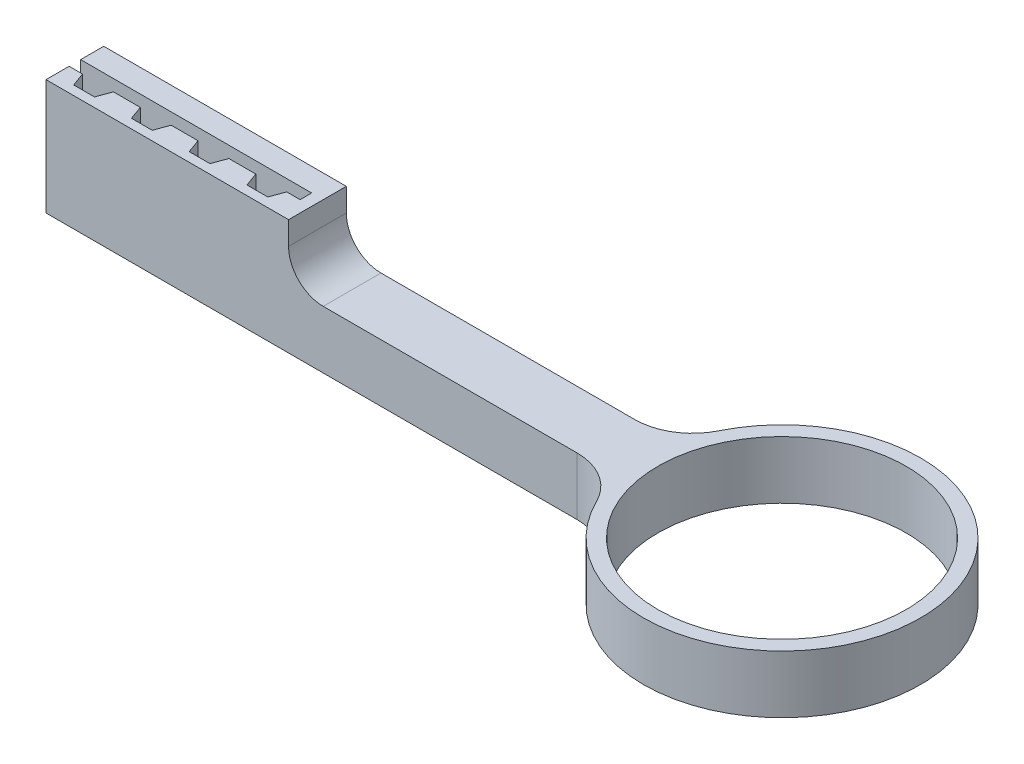
ISO-10303-21;
HEADER;
FILE_DESCRIPTION(('STEP AP214'),'2;1');
FILE_NAME('part.step','',(''),(''),'','','');
FILE_SCHEMA(('AUTOMOTIVE_DESIGN { 1 0 10303 214 1 1 1 1 }'));
ENDSEC;
DATA;
#1=APPLICATION_CONTEXT('core data for automotive mechanical design processes');
#2=APPLICATION_PROTOCOL_DEFINITION('international standard','automotive_design',2000,#1);
#3=PRODUCT_CONTEXT('',#1,'mechanical');
#4=PRODUCT('Part','Part','',(#3));
#5=PRODUCT_RELATED_PRODUCT_CATEGORY('part','',(#4));
#6=PRODUCT_DEFINITION_FORMATION('','',#4);
#7=PRODUCT_DEFINITION_CONTEXT('part definition',#1,'design');
#8=PRODUCT_DEFINITION('design','',#6,#7);
#9=PRODUCT_DEFINITION_SHAPE('','',#8);
#10=(LENGTH_UNIT() NAMED_UNIT(*) SI_UNIT(.MILLI.,.METRE.));
#11=(NAMED_UNIT(*) PLANE_ANGLE_UNIT() SI_UNIT($,.RADIAN.));
#12=(NAMED_UNIT(*) SI_UNIT($,.STERADIAN.) SOLID_ANGLE_UNIT());
#13=UNCERTAINTY_MEASURE_WITH_UNIT(LENGTH_MEASURE(1.E-05),#10,'distance_accuracy_value','');
#14=(GEOMETRIC_REPRESENTATION_CONTEXT(3) GLOBAL_UNCERTAINTY_ASSIGNED_CONTEXT((#13)) GLOBAL_UNIT_ASSIGNED_CONTEXT((#10,
#11,#12)) REPRESENTATION_CONTEXT('',''));
#15=CARTESIAN_POINT('',(0.,0.,0.));
#16=DIRECTION('',(0.,0.,1.));
#17=DIRECTION('',(1.,0.,0.));
#18=AXIS2_PLACEMENT_3D('',#15,#16,#17);
#19=CARTESIAN_POINT('',(-61.2249721603218,5.,-2.49999999999999));
#20=DIRECTION('',(1.,0.,0.));
#21=DIRECTION('',(0.,0.,-1.));
#22=AXIS2_PLACEMENT_3D('',#19,#20,#21);
#23=PLANE('',#22);
#24=DIRECTION('',(0.,0.,1.));
#25=VECTOR('',#24,1.);
#26=CARTESIAN_POINT('',(-61.2249721603218,0.,-2.49999999999999));
#27=LINE('',#26,#25);
#28=CARTESIAN_POINT('',(-61.2249721603218,0.,-2.49999999999999));
#29=VERTEX_POINT('',#28);
#30=CARTESIAN_POINT('',(-61.2249721603218,0.,-0.5));
#31=VERTEX_POINT('',#30);
#32=EDGE_CURVE('E409',#29,#31,#27,.T.);
#33=ORIENTED_EDGE('',*,*,#32,.T.);
#34=DIRECTION('',(0.,1.,0.));
#35=VECTOR('',#34,1.);
#36=CARTESIAN_POINT('',(-61.2249721603218,0.,-0.5));
#37=LINE('',#36,#35);
#38=CARTESIAN_POINT('',(-61.2249721603218,10.,-0.5));
#39=VERTEX_POINT('',#38);
#40=EDGE_CURVE('E346',#31,#39,#37,.T.);
#41=ORIENTED_EDGE('',*,*,#40,.T.);
#42=DIRECTION('',(0.,0.,1.));
#43=VECTOR('',#42,1.);
#44=CARTESIAN_POINT('',(-61.2249721603218,10.,-2.49999999999999));
#45=LINE('',#44,#43);
#46=CARTESIAN_POINT('',(-61.2249721603218,10.,-2.49999999999999));
#47=VERTEX_POINT('',#46);
#48=EDGE_CURVE('E384',#47,#39,#45,.T.);
#49=ORIENTED_EDGE('',*,*,#48,.F.);
#50=DIRECTION('',(0.,-1.,0.));
#51=VECTOR('',#50,1.);
#52=CARTESIAN_POINT('',(-61.2249721603218,5.,-2.49999999999999));
#53=LINE('',#52,#51);
#54=EDGE_CURVE('E416',#47,#29,#53,.T.);
#55=ORIENTED_EDGE('',*,*,#54,.T.);
#56=EDGE_LOOP('',(#33,#41,#49,#55));
#57=FACE_BOUND('',#56,.T.);
#58=ADVANCED_FACE('F31',(#57),#23,.F.);
#59=CARTESIAN_POINT('',(0.,5.,0.));
#60=DIRECTION('',(0.,1.,0.));
#61=DIRECTION('',(0.,0.,1.));
#62=AXIS2_PLACEMENT_3D('',#59,#60,#61);
#63=PLANE('',#62);
#64=CARTESIAN_POINT('',(0.,5.,0.));
#65=DIRECTION('',(0.,1.,0.));
#66=DIRECTION('',(0.,0.,1.));
#67=AXIS2_PLACEMENT_3D('',#64,#65,#66);
#68=CIRCLE('',#67,10.75);
#69=CARTESIAN_POINT('',(0.,5.,10.75));
#70=VERTEX_POINT('',#69);
#71=EDGE_CURVE('E420',#70,#70,#68,.T.);
#72=ORIENTED_EDGE('',*,*,#71,.F.);
#73=EDGE_LOOP('',(#72));
#74=FACE_BOUND('',#73,.T.);
#75=DIRECTION('',(-1.,0.,0.));
#76=VECTOR('',#75,1.);
#77=CARTESIAN_POINT('',(-11.2249721603218,5.,-2.49999999999999));
#78=LINE('',#77,#76);
#79=CARTESIAN_POINT('',(-15.2561463023924,5.,-2.49999999999999));
#80=VERTEX_POINT('',#79);
#81=CARTESIAN_POINT('',(-37.2249721603218,5.,-2.49999999999999));
#82=VERTEX_POINT('',#81);
#83=EDGE_CURVE('E400',#80,#82,#78,.T.);
#84=ORIENTED_EDGE('',*,*,#83,.T.);
#85=DIRECTION('',(0.,0.,1.));
#86=VECTOR('',#85,1.);
#87=CARTESIAN_POINT('',(-37.2249721603218,5.,0.));
#88=LINE('',#87,#86);
#89=CARTESIAN_POINT('',(-37.2249721603218,5.,2.50000000000001));
#90=VERTEX_POINT('',#89);
#91=EDGE_CURVE('E449',#82,#90,#88,.T.);
#92=ORIENTED_EDGE('',*,*,#91,.T.);
#93=DIRECTION('',(1.,0.,0.));
#94=VECTOR('',#93,1.);
#95=CARTESIAN_POINT('',(-11.2249721603218,5.,2.50000000000001));
#96=LINE('',#95,#94);
#97=CARTESIAN_POINT('',(-15.2561463023924,5.,2.50000000000001));
#98=VERTEX_POINT('',#97);
#99=EDGE_CURVE('E403',#90,#98,#96,.T.);
#100=ORIENTED_EDGE('',*,*,#99,.T.);
#101=CARTESIAN_POINT('',(-15.2561463023924,5.,7.50000000000001));
#102=DIRECTION('',(0.,1.,0.));
#103=DIRECTION('',(0.,0.,1.));
#104=AXIS2_PLACEMENT_3D('',#101,#102,#103);
#105=CIRCLE('',#104,5.);
#106=CARTESIAN_POINT('',(-10.7690444487475,5.,5.29411764705883));
#107=VERTEX_POINT('',#106);
#108=EDGE_CURVE('E441',#98,#107,#105,.F.);
#109=ORIENTED_EDGE('',*,*,#108,.T.);
#110=CARTESIAN_POINT('',(0.,5.,0.));
#111=DIRECTION('',(0.,1.,0.));
#112=DIRECTION('',(0.,0.,1.));
#113=AXIS2_PLACEMENT_3D('',#110,#111,#112);
#114=CIRCLE('',#113,12.);
#115=CARTESIAN_POINT('',(-10.7690444487476,5.,-5.29411764705882));
#116=VERTEX_POINT('',#115);
#117=EDGE_CURVE('E426',#107,#116,#114,.T.);
#118=ORIENTED_EDGE('',*,*,#117,.T.);
#119=CARTESIAN_POINT('',(-15.2561463023924,5.,-7.49999999999999));
#120=DIRECTION('',(0.,1.,0.));
#121=DIRECTION('',(0.,0.,1.));
#122=AXIS2_PLACEMENT_3D('',#119,#120,#121);
#123=CIRCLE('',#122,5.);
#124=EDGE_CURVE('E447',#116,#80,#123,.F.);
#125=ORIENTED_EDGE('',*,*,#124,.T.);
#126=EDGE_LOOP('',(#84,#92,#100,#109,#118,#125));
#127=FACE_BOUND('',#126,.T.);
#128=ADVANCED_FACE('F466',(#74,#127),#63,.T.);
#129=CARTESIAN_POINT('',(0.,5.,0.));
#130=DIRECTION('',(0.,-1.,0.));
#131=DIRECTION('',(0.,0.,-1.));
#132=AXIS2_PLACEMENT_3D('',#129,#130,#131);
#133=CYLINDRICAL_SURFACE('',#132,12.);
#134=ORIENTED_EDGE('',*,*,#117,.F.);
#135=DIRECTION('',(0.,-1.,0.));
#136=VECTOR('',#135,1.);
#137=CARTESIAN_POINT('',(-10.7690444487475,5.,5.29411764705883));
#138=LINE('',#137,#136);
#139=CARTESIAN_POINT('',(-10.7690444487475,0.,5.29411764705883));
#140=VERTEX_POINT('',#139);
#141=EDGE_CURVE('E436',#107,#140,#138,.T.);
#142=ORIENTED_EDGE('',*,*,#141,.T.);
#143=CARTESIAN_POINT('',(0.,0.,0.));
#144=DIRECTION('',(0.,1.,0.));
#145=DIRECTION('',(0.,0.,1.));
#146=AXIS2_PLACEMENT_3D('',#143,#144,#145);
#147=CIRCLE('',#146,12.);
#148=CARTESIAN_POINT('',(-10.7690444487476,0.,-5.29411764705882));
#149=VERTEX_POINT('',#148);
#150=EDGE_CURVE('E423',#140,#149,#147,.T.);
#151=ORIENTED_EDGE('',*,*,#150,.T.);
#152=DIRECTION('',(0.,-1.,0.));
#153=VECTOR('',#152,1.);
#154=CARTESIAN_POINT('',(-10.7690444487476,5.,-5.29411764705882));
#155=LINE('',#154,#153);
#156=EDGE_CURVE('E434',#149,#116,#155,.F.);
#157=ORIENTED_EDGE('',*,*,#156,.T.);
#158=EDGE_LOOP('',(#134,#142,#151,#157));
#159=FACE_BOUND('',#158,.T.);
#160=ADVANCED_FACE('F478',(#159),#133,.T.);
#161=CARTESIAN_POINT('',(0.,0.,0.));
#162=DIRECTION('',(0.,1.,0.));
#163=DIRECTION('',(0.,0.,1.));
#164=AXIS2_PLACEMENT_3D('',#161,#162,#163);
#165=PLANE('',#164);
#166=DIRECTION('',(0.,0.,-1.));
#167=VECTOR('',#166,1.);
#168=CARTESIAN_POINT('',(-41.2249721603218,0.,-0.5));
#169=LINE('',#168,#167);
#170=CARTESIAN_POINT('',(-41.2249721603218,0.,0.500000000000014));
#171=VERTEX_POINT('',#170);
#172=CARTESIAN_POINT('',(-41.2249721603218,0.,-0.5));
#173=VERTEX_POINT('',#172);
#174=EDGE_CURVE('E340',#171,#173,#169,.T.);
#175=ORIENTED_EDGE('',*,*,#174,.T.);
#176=DIRECTION('',(-1.,0.,0.));
#177=VECTOR('',#176,1.);
#178=CARTESIAN_POINT('',(-61.2249721603218,0.,-0.5));
#179=LINE('',#178,#177);
#180=EDGE_CURVE('E343',#173,#31,#179,.T.);
#181=ORIENTED_EDGE('',*,*,#180,.T.);
#182=ORIENTED_EDGE('',*,*,#32,.F.);
#183=DIRECTION('',(-1.,0.,0.));
#184=VECTOR('',#183,1.);
#185=CARTESIAN_POINT('',(-11.2249721603218,0.,-2.49999999999999));
#186=LINE('',#185,#184);
#187=CARTESIAN_POINT('',(-15.2561463023924,0.,-2.49999999999999));
#188=VERTEX_POINT('',#187);
#189=EDGE_CURVE('E399',#188,#29,#186,.T.);
#190=ORIENTED_EDGE('',*,*,#189,.F.);
#191=CARTESIAN_POINT('',(-15.2561463023924,0.,-7.49999999999999));
#192=DIRECTION('',(0.,1.,0.));
#193=DIRECTION('',(0.,0.,1.));
#194=AXIS2_PLACEMENT_3D('',#191,#192,#193);
#195=CIRCLE('',#194,5.);
#196=EDGE_CURVE('E445',#188,#149,#195,.T.);
#197=ORIENTED_EDGE('',*,*,#196,.T.);
#198=ORIENTED_EDGE('',*,*,#150,.F.);
#199=CARTESIAN_POINT('',(-15.2561463023924,0.,7.50000000000001));
#200=DIRECTION('',(0.,1.,0.));
#201=DIRECTION('',(0.,0.,1.));
#202=AXIS2_PLACEMENT_3D('',#199,#200,#201);
#203=CIRCLE('',#202,5.);
#204=CARTESIAN_POINT('',(-15.2561463023924,0.,2.50000000000001));
#205=VERTEX_POINT('',#204);
#206=EDGE_CURVE('E443',#140,#205,#203,.T.);
#207=ORIENTED_EDGE('',*,*,#206,.T.);
#208=DIRECTION('',(1.,0.,0.));
#209=VECTOR('',#208,1.);
#210=CARTESIAN_POINT('',(-11.2249721603218,0.,2.50000000000001));
#211=LINE('',#210,#209);
#212=CARTESIAN_POINT('',(-61.2249721603218,0.,2.50000000000001));
#213=VERTEX_POINT('',#212);
#214=EDGE_CURVE('E404',#213,#205,#211,.T.);
#215=ORIENTED_EDGE('',*,*,#214,.F.);
#216=CARTESIAN_POINT('',(-61.2249721603218,0.,0.500000000000014));
#217=VERTEX_POINT('',#216);
#218=EDGE_CURVE('E408',#217,#213,#27,.T.);
#219=ORIENTED_EDGE('',*,*,#218,.F.);
#220=DIRECTION('',(1.,0.,0.));
#221=VECTOR('',#220,1.);
#222=CARTESIAN_POINT('',(-60.0617364414413,0.,0.500000000000014));
#223=LINE('',#222,#221);
#224=CARTESIAN_POINT('',(-60.0617364414413,0.,0.500000000000014));
#225=VERTEX_POINT('',#224);
#226=EDGE_CURVE('E292',#217,#225,#223,.T.);
#227=ORIENTED_EDGE('',*,*,#226,.T.);
#228=DIRECTION('',(0.342020143325666,0.,0.939692620785909));
#229=VECTOR('',#228,1.);
#230=CARTESIAN_POINT('',(-60.0617364414413,0.,0.500000000000014));
#231=LINE('',#230,#229);
#232=CARTESIAN_POINT('',(-59.6249721603218,0.,1.70000000000001));
#233=VERTEX_POINT('',#232);
#234=EDGE_CURVE('E228',#225,#233,#231,.T.);
#235=ORIENTED_EDGE('',*,*,#234,.T.);
#236=DIRECTION('',(1.,0.,0.));
#237=VECTOR('',#236,1.);
#238=CARTESIAN_POINT('',(-59.6249721603218,0.,1.70000000000001));
#239=LINE('',#238,#237);
#240=CARTESIAN_POINT('',(-57.8249721603218,0.,1.70000000000001));
#241=VERTEX_POINT('',#240);
#242=EDGE_CURVE('E295',#233,#241,#239,.T.);
#243=ORIENTED_EDGE('',*,*,#242,.T.);
#244=DIRECTION('',(0.342020143325666,0.,-0.939692620785909));
#245=VECTOR('',#244,1.);
#246=CARTESIAN_POINT('',(-57.8249721603218,0.,1.70000000000001));
#247=LINE('',#246,#245);
#248=CARTESIAN_POINT('',(-57.3882078792024,0.,0.500000000000014));
#249=VERTEX_POINT('',#248);
#250=EDGE_CURVE('E298',#241,#249,#247,.T.);
#251=ORIENTED_EDGE('',*,*,#250,.T.);
#252=DIRECTION('',(1.,0.,0.));
#253=VECTOR('',#252,1.);
#254=CARTESIAN_POINT('',(-57.3882078792024,0.,0.500000000000014));
#255=LINE('',#254,#253);
#256=CARTESIAN_POINT('',(-55.0617364414413,0.,0.500000000000014));
#257=VERTEX_POINT('',#256);
#258=EDGE_CURVE('E301',#249,#257,#255,.T.);
#259=ORIENTED_EDGE('',*,*,#258,.T.);
#260=DIRECTION('',(0.342020143325666,0.,0.939692620785909));
#261=VECTOR('',#260,1.);
#262=CARTESIAN_POINT('',(-55.0617364414413,0.,0.500000000000014));
#263=LINE('',#262,#261);
#264=CARTESIAN_POINT('',(-54.6249721603218,0.,1.70000000000001));
#265=VERTEX_POINT('',#264);
#266=EDGE_CURVE('E304',#257,#265,#263,.T.);
#267=ORIENTED_EDGE('',*,*,#266,.T.);
#268=DIRECTION('',(1.,0.,0.));
#269=VECTOR('',#268,1.);
#270=CARTESIAN_POINT('',(-54.6249721603218,0.,1.70000000000001));
#271=LINE('',#270,#269);
#272=CARTESIAN_POINT('',(-52.8249721603218,0.,1.70000000000001));
#273=VERTEX_POINT('',#272);
#274=EDGE_CURVE('E307',#265,#273,#271,.T.);
#275=ORIENTED_EDGE('',*,*,#274,.T.);
#276=DIRECTION('',(0.342020143325666,0.,-0.939692620785909));
#277=VECTOR('',#276,1.);
#278=CARTESIAN_POINT('',(-52.8249721603218,0.,1.70000000000001));
#279=LINE('',#278,#277);
#280=CARTESIAN_POINT('',(-52.3882078792024,0.,0.500000000000014));
#281=VERTEX_POINT('',#280);
#282=EDGE_CURVE('E310',#273,#281,#279,.T.);
#283=ORIENTED_EDGE('',*,*,#282,.T.);
#284=DIRECTION('',(1.,0.,0.));
#285=VECTOR('',#284,1.);
#286=CARTESIAN_POINT('',(-52.3882078792024,0.,0.500000000000014));
#287=LINE('',#286,#285);
#288=CARTESIAN_POINT('',(-50.0617364414413,0.,0.500000000000014));
#289=VERTEX_POINT('',#288);
#290=EDGE_CURVE('E313',#281,#289,#287,.T.);
#291=ORIENTED_EDGE('',*,*,#290,.T.);
#292=DIRECTION('',(0.342020143325666,0.,0.939692620785909));
#293=VECTOR('',#292,1.);
#294=CARTESIAN_POINT('',(-50.0617364414413,0.,0.500000000000014));
#295=LINE('',#294,#293);
#296=CARTESIAN_POINT('',(-49.6249721603218,0.,1.70000000000001));
#297=VERTEX_POINT('',#296);
#298=EDGE_CURVE('E316',#289,#297,#295,.T.);
#299=ORIENTED_EDGE('',*,*,#298,.T.);
#300=DIRECTION('',(1.,0.,0.));
#301=VECTOR('',#300,1.);
#302=CARTESIAN_POINT('',(-49.6249721603218,0.,1.70000000000001));
#303=LINE('',#302,#301);
#304=CARTESIAN_POINT('',(-47.8249721603218,0.,1.70000000000001));
#305=VERTEX_POINT('',#304);
#306=EDGE_CURVE('E319',#297,#305,#303,.T.);
#307=ORIENTED_EDGE('',*,*,#306,.T.);
#308=DIRECTION('',(0.342020143325666,0.,-0.939692620785909));
#309=VECTOR('',#308,1.);
#310=CARTESIAN_POINT('',(-47.8249721603218,0.,1.70000000000001));
#311=LINE('',#310,#309);
#312=CARTESIAN_POINT('',(-47.3882078792024,0.,0.500000000000014));
#313=VERTEX_POINT('',#312);
#314=EDGE_CURVE('E322',#305,#313,#311,.T.);
#315=ORIENTED_EDGE('',*,*,#314,.T.);
#316=DIRECTION('',(1.,0.,0.));
#317=VECTOR('',#316,1.);
#318=CARTESIAN_POINT('',(-47.3882078792024,0.,0.500000000000014));
#319=LINE('',#318,#317);
#320=CARTESIAN_POINT('',(-45.0617364414413,0.,0.500000000000014));
#321=VERTEX_POINT('',#320);
#322=EDGE_CURVE('E325',#313,#321,#319,.T.);
#323=ORIENTED_EDGE('',*,*,#322,.T.);
#324=DIRECTION('',(0.342020143325666,0.,0.939692620785909));
#325=VECTOR('',#324,1.);
#326=CARTESIAN_POINT('',(-45.0617364414413,0.,0.500000000000014));
#327=LINE('',#326,#325);
#328=CARTESIAN_POINT('',(-44.6249721603218,0.,1.70000000000001));
#329=VERTEX_POINT('',#328);
#330=EDGE_CURVE('E328',#321,#329,#327,.T.);
#331=ORIENTED_EDGE('',*,*,#330,.T.);
#332=DIRECTION('',(1.,0.,0.));
#333=VECTOR('',#332,1.);
#334=CARTESIAN_POINT('',(-44.6249721603218,0.,1.70000000000001));
#335=LINE('',#334,#333);
#336=CARTESIAN_POINT('',(-42.8249721603218,0.,1.70000000000001));
#337=VERTEX_POINT('',#336);
#338=EDGE_CURVE('E331',#329,#337,#335,.T.);
#339=ORIENTED_EDGE('',*,*,#338,.T.);
#340=DIRECTION('',(0.342020143325666,0.,-0.939692620785909));
#341=VECTOR('',#340,1.);
#342=CARTESIAN_POINT('',(-42.8249721603218,0.,1.70000000000001));
#343=LINE('',#342,#341);
#344=CARTESIAN_POINT('',(-42.3882078792024,0.,0.500000000000014));
#345=VERTEX_POINT('',#344);
#346=EDGE_CURVE('E334',#337,#345,#343,.T.);
#347=ORIENTED_EDGE('',*,*,#346,.T.);
#348=DIRECTION('',(1.,0.,0.));
#349=VECTOR('',#348,1.);
#350=CARTESIAN_POINT('',(-42.3882078792024,0.,0.500000000000014));
#351=LINE('',#350,#349);
#352=EDGE_CURVE('E337',#345,#171,#351,.T.);
#353=ORIENTED_EDGE('',*,*,#352,.T.);
#354=EDGE_LOOP('',(#175,#181,#182,#190,#197,#198,#207,#215,#219,#227,#235,#243,#251,#259,#267,
#275,#283,#291,#299,#307,#315,#323,#331,#339,#347,#353));
#355=FACE_BOUND('',#354,.T.);
#356=CARTESIAN_POINT('',(0.,0.,0.));
#357=DIRECTION('',(0.,1.,0.));
#358=DIRECTION('',(0.,0.,1.));
#359=AXIS2_PLACEMENT_3D('',#356,#357,#358);
#360=CIRCLE('',#359,10.75);
#361=CARTESIAN_POINT('',(0.,0.,10.75));
#362=VERTEX_POINT('',#361);
#363=EDGE_CURVE('E419',#362,#362,#360,.T.);
#364=ORIENTED_EDGE('',*,*,#363,.T.);
#365=EDGE_LOOP('',(#364));
#366=FACE_BOUND('',#365,.T.);
#367=ADVANCED_FACE('F487',(#355,#366),#165,.F.);
#368=CARTESIAN_POINT('',(0.,5.,0.));
#369=DIRECTION('',(0.,-1.,0.));
#370=DIRECTION('',(0.,0.,-1.));
#371=AXIS2_PLACEMENT_3D('',#368,#369,#370);
#372=CYLINDRICAL_SURFACE('',#371,10.75);
#373=ORIENTED_EDGE('',*,*,#71,.T.);
#374=EDGE_LOOP('',(#373));
#375=FACE_BOUND('',#374,.T.);
#376=ORIENTED_EDGE('',*,*,#363,.F.);
#377=EDGE_LOOP('',(#376));
#378=FACE_BOUND('',#377,.T.);
#379=ADVANCED_FACE('F519',(#375,#378),#372,.F.);
#380=CARTESIAN_POINT('',(-11.2249721603218,5.,-2.49999999999999));
#381=DIRECTION('',(0.,0.,1.));
#382=DIRECTION('',(1.,0.,0.));
#383=AXIS2_PLACEMENT_3D('',#380,#381,#382);
#384=PLANE('',#383);
#385=ORIENTED_EDGE('',*,*,#83,.F.);
#386=DIRECTION('',(0.,1.,0.));
#387=VECTOR('',#386,1.);
#388=CARTESIAN_POINT('',(-15.2561463023924,0.,-2.49999999999999));
#389=LINE('',#388,#387);
#390=EDGE_CURVE('E438',#80,#188,#389,.F.);
#391=ORIENTED_EDGE('',*,*,#390,.T.);
#392=ORIENTED_EDGE('',*,*,#189,.T.);
#393=ORIENTED_EDGE('',*,*,#54,.F.);
#394=DIRECTION('',(-1.,0.,0.));
#395=VECTOR('',#394,1.);
#396=CARTESIAN_POINT('',(-61.2249721603218,10.,-2.49999999999999));
#397=LINE('',#396,#395);
#398=CARTESIAN_POINT('',(-40.2249721603218,10.,-2.49999999999999));
#399=VERTEX_POINT('',#398);
#400=EDGE_CURVE('E391',#399,#47,#397,.T.);
#401=ORIENTED_EDGE('',*,*,#400,.F.);
#402=DIRECTION('',(0.,-1.,0.));
#403=VECTOR('',#402,1.);
#404=CARTESIAN_POINT('',(-40.2249721603218,10.,-2.49999999999999));
#405=LINE('',#404,#403);
#406=CARTESIAN_POINT('',(-40.2249721603218,8.,-2.49999999999999));
#407=VERTEX_POINT('',#406);
#408=EDGE_CURVE('E394',#399,#407,#405,.T.);
#409=ORIENTED_EDGE('',*,*,#408,.T.);
#410=CARTESIAN_POINT('',(-37.2249721603218,8.,-2.49999999999999));
#411=DIRECTION('',(0.,0.,1.));
#412=DIRECTION('',(1.,0.,0.));
#413=AXIS2_PLACEMENT_3D('',#410,#411,#412);
#414=CIRCLE('',#413,3.);
#415=EDGE_CURVE('E11',#407,#82,#414,.T.);
#416=ORIENTED_EDGE('',*,*,#415,.T.);
#417=EDGE_LOOP('',(#385,#391,#392,#393,#401,#409,#416));
#418=FACE_BOUND('',#417,.T.);
#419=ADVANCED_FACE('F463',(#418),#384,.F.);
#420=CARTESIAN_POINT('',(-11.2249721603218,5.,2.50000000000001));
#421=DIRECTION('',(0.,0.,-1.));
#422=DIRECTION('',(-1.,0.,0.));
#423=AXIS2_PLACEMENT_3D('',#420,#421,#422);
#424=PLANE('',#423);
#425=ORIENTED_EDGE('',*,*,#214,.T.);
#426=DIRECTION('',(0.,1.,0.));
#427=VECTOR('',#426,1.);
#428=CARTESIAN_POINT('',(-15.2561463023924,5.,2.50000000000001));
#429=LINE('',#428,#427);
#430=EDGE_CURVE('E429',#205,#98,#429,.T.);
#431=ORIENTED_EDGE('',*,*,#430,.T.);
#432=ORIENTED_EDGE('',*,*,#99,.F.);
#433=CARTESIAN_POINT('',(-37.2249721603218,8.,2.50000000000001));
#434=DIRECTION('',(0.,0.,-1.));
#435=DIRECTION('',(-1.,0.,0.));
#436=AXIS2_PLACEMENT_3D('',#433,#434,#435);
#437=CIRCLE('',#436,3.);
#438=CARTESIAN_POINT('',(-40.2249721603218,8.,2.50000000000001));
#439=VERTEX_POINT('',#438);
#440=EDGE_CURVE('E39',#90,#439,#437,.T.);
#441=ORIENTED_EDGE('',*,*,#440,.T.);
#442=DIRECTION('',(0.,-1.,0.));
#443=VECTOR('',#442,1.);
#444=CARTESIAN_POINT('',(-40.2249721603218,10.,2.50000000000001));
#445=LINE('',#444,#443);
#446=CARTESIAN_POINT('',(-40.2249721603218,10.,2.50000000000001));
#447=VERTEX_POINT('',#446);
#448=EDGE_CURVE('E397',#447,#439,#445,.T.);
#449=ORIENTED_EDGE('',*,*,#448,.F.);
#450=DIRECTION('',(1.,0.,0.));
#451=VECTOR('',#450,1.);
#452=CARTESIAN_POINT('',(-61.2249721603218,10.,2.50000000000001));
#453=LINE('',#452,#451);
#454=CARTESIAN_POINT('',(-61.2249721603218,10.,2.50000000000001));
#455=VERTEX_POINT('',#454);
#456=EDGE_CURVE('E387',#455,#447,#453,.T.);
#457=ORIENTED_EDGE('',*,*,#456,.F.);
#458=DIRECTION('',(0.,-1.,0.));
#459=VECTOR('',#458,1.);
#460=CARTESIAN_POINT('',(-61.2249721603218,5.,2.50000000000001));
#461=LINE('',#460,#459);
#462=EDGE_CURVE('E406',#455,#213,#461,.T.);
#463=ORIENTED_EDGE('',*,*,#462,.T.);
#464=EDGE_LOOP('',(#425,#431,#432,#441,#449,#457,#463));
#465=FACE_BOUND('',#464,.T.);
#466=ADVANCED_FACE('F468',(#465),#424,.F.);
#467=CARTESIAN_POINT('',(-61.2249721603218,10.,0.500000000000014));
#468=VERTEX_POINT('',#467);
#469=EDGE_CURVE('E349',#468,#455,#45,.T.);
#470=ORIENTED_EDGE('',*,*,#469,.F.);
#471=DIRECTION('',(0.,1.,0.));
#472=VECTOR('',#471,1.);
#473=CARTESIAN_POINT('',(-61.2249721603218,0.,0.500000000000014));
#474=LINE('',#473,#472);
#475=EDGE_CURVE('E46',#217,#468,#474,.T.);
#476=ORIENTED_EDGE('',*,*,#475,.F.);
#477=ORIENTED_EDGE('',*,*,#218,.T.);
#478=ORIENTED_EDGE('',*,*,#462,.F.);
#479=EDGE_LOOP('',(#470,#476,#477,#478));
#480=FACE_BOUND('',#479,.T.);
#481=ADVANCED_FACE('F496',(#480),#23,.F.);
#482=CARTESIAN_POINT('',(-40.2249721603218,10.,-2.49999999999999));
#483=DIRECTION('',(-1.,0.,0.));
#484=DIRECTION('',(0.,0.,1.));
#485=AXIS2_PLACEMENT_3D('',#482,#483,#484);
#486=PLANE('',#485);
#487=ORIENTED_EDGE('',*,*,#448,.T.);
#488=DIRECTION('',(0.,0.,1.));
#489=VECTOR('',#488,1.);
#490=CARTESIAN_POINT('',(-40.2249721603218,8.,-2.49999999999999));
#491=LINE('',#490,#489);
#492=EDGE_CURVE('E452',#439,#407,#491,.F.);
#493=ORIENTED_EDGE('',*,*,#492,.T.);
#494=ORIENTED_EDGE('',*,*,#408,.F.);
#495=DIRECTION('',(0.,0.,-1.));
#496=VECTOR('',#495,1.);
#497=CARTESIAN_POINT('',(-40.2249721603218,10.,-2.49999999999999));
#498=LINE('',#497,#496);
#499=EDGE_CURVE('E389',#447,#399,#498,.T.);
#500=ORIENTED_EDGE('',*,*,#499,.F.);
#501=EDGE_LOOP('',(#487,#493,#494,#500));
#502=FACE_BOUND('',#501,.T.);
#503=ADVANCED_FACE('F456',(#502),#486,.F.);
#504=CARTESIAN_POINT('',(-61.2249721603218,10.,2.50000000000001));
#505=DIRECTION('',(0.,1.,0.));
#506=DIRECTION('',(0.,0.,1.));
#507=AXIS2_PLACEMENT_3D('',#504,#505,#506);
#508=PLANE('',#507);
#509=DIRECTION('',(-1.,0.,0.));
#510=VECTOR('',#509,1.);
#511=CARTESIAN_POINT('',(-61.2249721603218,10.,-0.5));
#512=LINE('',#511,#510);
#513=CARTESIAN_POINT('',(-41.2249721603218,10.,-0.5));
#514=VERTEX_POINT('',#513);
#515=EDGE_CURVE('E290',#514,#39,#512,.T.);
#516=ORIENTED_EDGE('',*,*,#515,.F.);
#517=DIRECTION('',(0.,0.,-1.));
#518=VECTOR('',#517,1.);
#519=CARTESIAN_POINT('',(-41.2249721603218,10.,-0.5));
#520=LINE('',#519,#518);
#521=CARTESIAN_POINT('',(-41.2249721603218,10.,0.500000000000014));
#522=VERTEX_POINT('',#521);
#523=EDGE_CURVE('E287',#522,#514,#520,.T.);
#524=ORIENTED_EDGE('',*,*,#523,.F.);
#525=DIRECTION('',(1.,0.,0.));
#526=VECTOR('',#525,1.);
#527=CARTESIAN_POINT('',(-42.3882078792024,10.,0.500000000000014));
#528=LINE('',#527,#526);
#529=CARTESIAN_POINT('',(-42.3882078792024,10.,0.500000000000014));
#530=VERTEX_POINT('',#529);
#531=EDGE_CURVE('E284',#530,#522,#528,.T.);
#532=ORIENTED_EDGE('',*,*,#531,.F.);
#533=DIRECTION('',(0.342020143325666,0.,-0.939692620785909));
#534=VECTOR('',#533,1.);
#535=CARTESIAN_POINT('',(-42.8249721603218,10.,1.70000000000001));
#536=LINE('',#535,#534);
#537=CARTESIAN_POINT('',(-42.8249721603218,10.,1.70000000000001));
#538=VERTEX_POINT('',#537);
#539=EDGE_CURVE('E281',#538,#530,#536,.T.);
#540=ORIENTED_EDGE('',*,*,#539,.F.);
#541=DIRECTION('',(1.,0.,0.));
#542=VECTOR('',#541,1.);
#543=CARTESIAN_POINT('',(-44.6249721603218,10.,1.70000000000001));
#544=LINE('',#543,#542);
#545=CARTESIAN_POINT('',(-44.6249721603218,10.,1.70000000000001));
#546=VERTEX_POINT('',#545);
#547=EDGE_CURVE('E278',#546,#538,#544,.T.);
#548=ORIENTED_EDGE('',*,*,#547,.F.);
#549=DIRECTION('',(0.342020143325666,0.,0.939692620785909));
#550=VECTOR('',#549,1.);
#551=CARTESIAN_POINT('',(-45.0617364414413,10.,0.500000000000014));
#552=LINE('',#551,#550);
#553=CARTESIAN_POINT('',(-45.0617364414413,10.,0.500000000000014));
#554=VERTEX_POINT('',#553);
#555=EDGE_CURVE('E275',#554,#546,#552,.T.);
#556=ORIENTED_EDGE('',*,*,#555,.F.);
#557=DIRECTION('',(1.,0.,0.));
#558=VECTOR('',#557,1.);
#559=CARTESIAN_POINT('',(-47.3882078792024,10.,0.500000000000014));
#560=LINE('',#559,#558);
#561=CARTESIAN_POINT('',(-47.3882078792024,10.,0.500000000000014));
#562=VERTEX_POINT('',#561);
#563=EDGE_CURVE('E272',#562,#554,#560,.T.);
#564=ORIENTED_EDGE('',*,*,#563,.F.);
#565=DIRECTION('',(0.342020143325666,0.,-0.939692620785909));
#566=VECTOR('',#565,1.);
#567=CARTESIAN_POINT('',(-47.8249721603218,10.,1.70000000000001));
#568=LINE('',#567,#566);
#569=CARTESIAN_POINT('',(-47.8249721603218,10.,1.70000000000001));
#570=VERTEX_POINT('',#569);
#571=EDGE_CURVE('E269',#570,#562,#568,.T.);
#572=ORIENTED_EDGE('',*,*,#571,.F.);
#573=DIRECTION('',(1.,0.,0.));
#574=VECTOR('',#573,1.);
#575=CARTESIAN_POINT('',(-49.6249721603218,10.,1.70000000000001));
#576=LINE('',#575,#574);
#577=CARTESIAN_POINT('',(-49.6249721603218,10.,1.70000000000001));
#578=VERTEX_POINT('',#577);
#579=EDGE_CURVE('E266',#578,#570,#576,.T.);
#580=ORIENTED_EDGE('',*,*,#579,.F.);
#581=DIRECTION('',(0.342020143325666,0.,0.939692620785909));
#582=VECTOR('',#581,1.);
#583=CARTESIAN_POINT('',(-50.0617364414413,10.,0.500000000000014));
#584=LINE('',#583,#582);
#585=CARTESIAN_POINT('',(-50.0617364414413,10.,0.500000000000014));
#586=VERTEX_POINT('',#585);
#587=EDGE_CURVE('E263',#586,#578,#584,.T.);
#588=ORIENTED_EDGE('',*,*,#587,.F.);
#589=DIRECTION('',(1.,0.,0.));
#590=VECTOR('',#589,1.);
#591=CARTESIAN_POINT('',(-52.3882078792024,10.,0.500000000000014));
#592=LINE('',#591,#590);
#593=CARTESIAN_POINT('',(-52.3882078792024,10.,0.500000000000014));
#594=VERTEX_POINT('',#593);
#595=EDGE_CURVE('E260',#594,#586,#592,.T.);
#596=ORIENTED_EDGE('',*,*,#595,.F.);
#597=DIRECTION('',(0.342020143325666,0.,-0.939692620785909));
#598=VECTOR('',#597,1.);
#599=CARTESIAN_POINT('',(-52.8249721603218,10.,1.70000000000001));
#600=LINE('',#599,#598);
#601=CARTESIAN_POINT('',(-52.8249721603218,10.,1.70000000000001));
#602=VERTEX_POINT('',#601);
#603=EDGE_CURVE('E257',#602,#594,#600,.T.);
#604=ORIENTED_EDGE('',*,*,#603,.F.);
#605=DIRECTION('',(1.,0.,0.));
#606=VECTOR('',#605,1.);
#607=CARTESIAN_POINT('',(-54.6249721603218,10.,1.70000000000001));
#608=LINE('',#607,#606);
#609=CARTESIAN_POINT('',(-54.6249721603218,10.,1.70000000000001));
#610=VERTEX_POINT('',#609);
#611=EDGE_CURVE('E254',#610,#602,#608,.T.);
#612=ORIENTED_EDGE('',*,*,#611,.F.);
#613=DIRECTION('',(0.342020143325666,0.,0.939692620785909));
#614=VECTOR('',#613,1.);
#615=CARTESIAN_POINT('',(-55.0617364414413,10.,0.500000000000014));
#616=LINE('',#615,#614);
#617=CARTESIAN_POINT('',(-55.0617364414413,10.,0.500000000000014));
#618=VERTEX_POINT('',#617);
#619=EDGE_CURVE('E251',#618,#610,#616,.T.);
#620=ORIENTED_EDGE('',*,*,#619,.F.);
#621=DIRECTION('',(1.,0.,0.));
#622=VECTOR('',#621,1.);
#623=CARTESIAN_POINT('',(-57.3882078792024,10.,0.500000000000014));
#624=LINE('',#623,#622);
#625=CARTESIAN_POINT('',(-57.3882078792024,10.,0.500000000000014));
#626=VERTEX_POINT('',#625);
#627=EDGE_CURVE('E248',#626,#618,#624,.T.);
#628=ORIENTED_EDGE('',*,*,#627,.F.);
#629=DIRECTION('',(0.342020143325666,0.,-0.939692620785909));
#630=VECTOR('',#629,1.);
#631=CARTESIAN_POINT('',(-57.8249721603218,10.,1.70000000000001));
#632=LINE('',#631,#630);
#633=CARTESIAN_POINT('',(-57.8249721603218,10.,1.70000000000001));
#634=VERTEX_POINT('',#633);
#635=EDGE_CURVE('E243',#634,#626,#632,.T.);
#636=ORIENTED_EDGE('',*,*,#635,.F.);
#637=DIRECTION('',(1.,0.,0.));
#638=VECTOR('',#637,1.);
#639=CARTESIAN_POINT('',(-59.6249721603218,10.,1.70000000000001));
#640=LINE('',#639,#638);
#641=CARTESIAN_POINT('',(-59.6249721603218,10.,1.70000000000001));
#642=VERTEX_POINT('',#641);
#643=EDGE_CURVE('E241',#642,#634,#640,.T.);
#644=ORIENTED_EDGE('',*,*,#643,.F.);
#645=DIRECTION('',(0.342020143325666,0.,0.939692620785909));
#646=VECTOR('',#645,1.);
#647=CARTESIAN_POINT('',(-60.0617364414413,10.,0.500000000000014));
#648=LINE('',#647,#646);
#649=CARTESIAN_POINT('',(-60.0617364414413,10.,0.500000000000014));
#650=VERTEX_POINT('',#649);
#651=EDGE_CURVE('E225',#650,#642,#648,.T.);
#652=ORIENTED_EDGE('',*,*,#651,.F.);
#653=DIRECTION('',(1.,0.,0.));
#654=VECTOR('',#653,1.);
#655=CARTESIAN_POINT('',(-60.0617364414413,10.,0.500000000000014));
#656=LINE('',#655,#654);
#657=EDGE_CURVE('E232',#468,#650,#656,.T.);
#658=ORIENTED_EDGE('',*,*,#657,.F.);
#659=ORIENTED_EDGE('',*,*,#469,.T.);
#660=ORIENTED_EDGE('',*,*,#456,.T.);
#661=ORIENTED_EDGE('',*,*,#499,.T.);
#662=ORIENTED_EDGE('',*,*,#400,.T.);
#663=ORIENTED_EDGE('',*,*,#48,.T.);
#664=EDGE_LOOP('',(#516,#524,#532,#540,#548,#556,#564,#572,#580,#588,#596,#604,#612,#620,#628,
#636,#644,#652,#658,#659,#660,#661,#662,#663));
#665=FACE_BOUND('',#664,.T.);
#666=ADVANCED_FACE('F238',(#665),#508,.T.);
#667=CARTESIAN_POINT('',(-15.2561463023924,5.,7.50000000000001));
#668=DIRECTION('',(0.,-1.,0.));
#669=DIRECTION('',(0.,0.,-1.));
#670=AXIS2_PLACEMENT_3D('',#667,#668,#669);
#671=CYLINDRICAL_SURFACE('',#670,5.);
#672=ORIENTED_EDGE('',*,*,#206,.F.);
#673=ORIENTED_EDGE('',*,*,#141,.F.);
#674=ORIENTED_EDGE('',*,*,#108,.F.);
#675=ORIENTED_EDGE('',*,*,#430,.F.);
#676=EDGE_LOOP('',(#672,#673,#674,#675));
#677=FACE_BOUND('',#676,.T.);
#678=ADVANCED_FACE('F473',(#677),#671,.F.);
#679=CARTESIAN_POINT('',(-15.2561463023924,5.,-7.49999999999999));
#680=DIRECTION('',(0.,-1.,0.));
#681=DIRECTION('',(0.,0.,-1.));
#682=AXIS2_PLACEMENT_3D('',#679,#680,#681);
#683=CYLINDRICAL_SURFACE('',#682,5.);
#684=ORIENTED_EDGE('',*,*,#124,.F.);
#685=ORIENTED_EDGE('',*,*,#156,.F.);
#686=ORIENTED_EDGE('',*,*,#196,.F.);
#687=ORIENTED_EDGE('',*,*,#390,.F.);
#688=EDGE_LOOP('',(#684,#685,#686,#687));
#689=FACE_BOUND('',#688,.T.);
#690=ADVANCED_FACE('F482',(#689),#683,.F.);
#691=CARTESIAN_POINT('',(-37.2249721603218,8.,0.));
#692=DIRECTION('',(0.,0.,1.));
#693=DIRECTION('',(1.,0.,0.));
#694=AXIS2_PLACEMENT_3D('',#691,#692,#693);
#695=CYLINDRICAL_SURFACE('',#694,3.);
#696=ORIENTED_EDGE('',*,*,#415,.F.);
#697=ORIENTED_EDGE('',*,*,#492,.F.);
#698=ORIENTED_EDGE('',*,*,#440,.F.);
#699=ORIENTED_EDGE('',*,*,#91,.F.);
#700=EDGE_LOOP('',(#696,#697,#698,#699));
#701=FACE_BOUND('',#700,.T.);
#702=ADVANCED_FACE('F33',(#701),#695,.F.);
#703=CARTESIAN_POINT('',(-61.2249721603218,0.,-0.5));
#704=DIRECTION('',(0.,0.,-1.));
#705=DIRECTION('',(-1.,0.,0.));
#706=AXIS2_PLACEMENT_3D('',#703,#704,#705);
#707=PLANE('',#706);
#708=ORIENTED_EDGE('',*,*,#40,.F.);
#709=ORIENTED_EDGE('',*,*,#180,.F.);
#710=DIRECTION('',(0.,1.,0.));
#711=VECTOR('',#710,1.);
#712=CARTESIAN_POINT('',(-41.2249721603218,0.,-0.5));
#713=LINE('',#712,#711);
#714=EDGE_CURVE('E350',#173,#514,#713,.T.);
#715=ORIENTED_EDGE('',*,*,#714,.T.);
#716=ORIENTED_EDGE('',*,*,#515,.T.);
#717=EDGE_LOOP('',(#708,#709,#715,#716));
#718=FACE_BOUND('',#717,.T.);
#719=ADVANCED_FACE('F527',(#718),#707,.F.);
#720=CARTESIAN_POINT('',(-41.2249721603218,0.,-0.5));
#721=DIRECTION('',(1.,0.,0.));
#722=DIRECTION('',(0.,0.,-1.));
#723=AXIS2_PLACEMENT_3D('',#720,#721,#722);
#724=PLANE('',#723);
#725=ORIENTED_EDGE('',*,*,#714,.F.);
#726=ORIENTED_EDGE('',*,*,#174,.F.);
#727=DIRECTION('',(0.,1.,0.));
#728=VECTOR('',#727,1.);
#729=CARTESIAN_POINT('',(-41.2249721603218,0.,0.500000000000014));
#730=LINE('',#729,#728);
#731=EDGE_CURVE('E352',#171,#522,#730,.T.);
#732=ORIENTED_EDGE('',*,*,#731,.T.);
#733=ORIENTED_EDGE('',*,*,#523,.T.);
#734=EDGE_LOOP('',(#725,#726,#732,#733));
#735=FACE_BOUND('',#734,.T.);
#736=ADVANCED_FACE('F531',(#735),#724,.F.);
#737=CARTESIAN_POINT('',(-42.3882078792024,0.,0.500000000000014));
#738=DIRECTION('',(0.,0.,1.));
#739=DIRECTION('',(1.,0.,0.));
#740=AXIS2_PLACEMENT_3D('',#737,#738,#739);
#741=PLANE('',#740);
#742=ORIENTED_EDGE('',*,*,#731,.F.);
#743=ORIENTED_EDGE('',*,*,#352,.F.);
#744=DIRECTION('',(0.,1.,0.));
#745=VECTOR('',#744,1.);
#746=CARTESIAN_POINT('',(-42.3882078792024,0.,0.500000000000014));
#747=LINE('',#746,#745);
#748=EDGE_CURVE('E354',#345,#530,#747,.T.);
#749=ORIENTED_EDGE('',*,*,#748,.T.);
#750=ORIENTED_EDGE('',*,*,#531,.T.);
#751=EDGE_LOOP('',(#742,#743,#749,#750));
#752=FACE_BOUND('',#751,.T.);
#753=ADVANCED_FACE('F537',(#752),#741,.F.);
#754=CARTESIAN_POINT('',(-42.8249721603218,0.,1.70000000000001));
#755=DIRECTION('',(0.939692620785909,0.,0.342020143325666));
#756=DIRECTION('',(0.342020143325666,0.,-0.939692620785909));
#757=AXIS2_PLACEMENT_3D('',#754,#755,#756);
#758=PLANE('',#757);
#759=ORIENTED_EDGE('',*,*,#748,.F.);
#760=ORIENTED_EDGE('',*,*,#346,.F.);
#761=DIRECTION('',(0.,1.,0.));
#762=VECTOR('',#761,1.);
#763=CARTESIAN_POINT('',(-42.8249721603218,0.,1.70000000000001));
#764=LINE('',#763,#762);
#765=EDGE_CURVE('E356',#337,#538,#764,.T.);
#766=ORIENTED_EDGE('',*,*,#765,.T.);
#767=ORIENTED_EDGE('',*,*,#539,.T.);
#768=EDGE_LOOP('',(#759,#760,#766,#767));
#769=FACE_BOUND('',#768,.T.);
#770=ADVANCED_FACE('F543',(#769),#758,.F.);
#771=CARTESIAN_POINT('',(-44.6249721603218,0.,1.70000000000001));
#772=DIRECTION('',(0.,0.,1.));
#773=DIRECTION('',(1.,0.,0.));
#774=AXIS2_PLACEMENT_3D('',#771,#772,#773);
#775=PLANE('',#774);
#776=ORIENTED_EDGE('',*,*,#765,.F.);
#777=ORIENTED_EDGE('',*,*,#338,.F.);
#778=DIRECTION('',(0.,1.,0.));
#779=VECTOR('',#778,1.);
#780=CARTESIAN_POINT('',(-44.6249721603218,0.,1.70000000000001));
#781=LINE('',#780,#779);
#782=EDGE_CURVE('E358',#329,#546,#781,.T.);
#783=ORIENTED_EDGE('',*,*,#782,.T.);
#784=ORIENTED_EDGE('',*,*,#547,.T.);
#785=EDGE_LOOP('',(#776,#777,#783,#784));
#786=FACE_BOUND('',#785,.T.);
#787=ADVANCED_FACE('F547',(#786),#775,.F.);
#788=CARTESIAN_POINT('',(-45.0617364414413,0.,0.500000000000014));
#789=DIRECTION('',(-0.939692620785909,0.,0.342020143325666));
#790=DIRECTION('',(0.342020143325666,0.,0.939692620785909));
#791=AXIS2_PLACEMENT_3D('',#788,#789,#790);
#792=PLANE('',#791);
#793=ORIENTED_EDGE('',*,*,#782,.F.);
#794=ORIENTED_EDGE('',*,*,#330,.F.);
#795=DIRECTION('',(0.,1.,0.));
#796=VECTOR('',#795,1.);
#797=CARTESIAN_POINT('',(-45.0617364414413,0.,0.500000000000014));
#798=LINE('',#797,#796);
#799=EDGE_CURVE('E360',#321,#554,#798,.T.);
#800=ORIENTED_EDGE('',*,*,#799,.T.);
#801=ORIENTED_EDGE('',*,*,#555,.T.);
#802=EDGE_LOOP('',(#793,#794,#800,#801));
#803=FACE_BOUND('',#802,.T.);
#804=ADVANCED_FACE('F551',(#803),#792,.F.);
#805=CARTESIAN_POINT('',(-45.0617364414413,0.,0.500000000000014));
#806=DIRECTION('',(0.,0.,1.));
#807=DIRECTION('',(1.,0.,0.));
#808=AXIS2_PLACEMENT_3D('',#805,#806,#807);
#809=PLANE('',#808);
#810=ORIENTED_EDGE('',*,*,#799,.F.);
#811=ORIENTED_EDGE('',*,*,#322,.F.);
#812=DIRECTION('',(0.,1.,0.));
#813=VECTOR('',#812,1.);
#814=CARTESIAN_POINT('',(-47.3882078792024,0.,0.500000000000014));
#815=LINE('',#814,#813);
#816=EDGE_CURVE('E362',#313,#562,#815,.T.);
#817=ORIENTED_EDGE('',*,*,#816,.T.);
#818=ORIENTED_EDGE('',*,*,#563,.T.);
#819=EDGE_LOOP('',(#810,#811,#817,#818));
#820=FACE_BOUND('',#819,.T.);
#821=ADVANCED_FACE('F555',(#820),#809,.F.);
#822=CARTESIAN_POINT('',(-47.8249721603218,0.,1.70000000000001));
#823=DIRECTION('',(0.939692620785909,0.,0.342020143325666));
#824=DIRECTION('',(0.342020143325666,0.,-0.939692620785909));
#825=AXIS2_PLACEMENT_3D('',#822,#823,#824);
#826=PLANE('',#825);
#827=ORIENTED_EDGE('',*,*,#816,.F.);
#828=ORIENTED_EDGE('',*,*,#314,.F.);
#829=DIRECTION('',(0.,1.,0.));
#830=VECTOR('',#829,1.);
#831=CARTESIAN_POINT('',(-47.8249721603218,0.,1.70000000000001));
#832=LINE('',#831,#830);
#833=EDGE_CURVE('E364',#305,#570,#832,.T.);
#834=ORIENTED_EDGE('',*,*,#833,.T.);
#835=ORIENTED_EDGE('',*,*,#571,.T.);
#836=EDGE_LOOP('',(#827,#828,#834,#835));
#837=FACE_BOUND('',#836,.T.);
#838=ADVANCED_FACE('F559',(#837),#826,.F.);
#839=CARTESIAN_POINT('',(-49.6249721603218,0.,1.70000000000001));
#840=DIRECTION('',(0.,0.,1.));
#841=DIRECTION('',(1.,0.,0.));
#842=AXIS2_PLACEMENT_3D('',#839,#840,#841);
#843=PLANE('',#842);
#844=ORIENTED_EDGE('',*,*,#833,.F.);
#845=ORIENTED_EDGE('',*,*,#306,.F.);
#846=DIRECTION('',(0.,1.,0.));
#847=VECTOR('',#846,1.);
#848=CARTESIAN_POINT('',(-49.6249721603218,0.,1.70000000000001));
#849=LINE('',#848,#847);
#850=EDGE_CURVE('E366',#297,#578,#849,.T.);
#851=ORIENTED_EDGE('',*,*,#850,.T.);
#852=ORIENTED_EDGE('',*,*,#579,.T.);
#853=EDGE_LOOP('',(#844,#845,#851,#852));
#854=FACE_BOUND('',#853,.T.);
#855=ADVANCED_FACE('F563',(#854),#843,.F.);
#856=CARTESIAN_POINT('',(-50.0617364414413,0.,0.500000000000014));
#857=DIRECTION('',(-0.939692620785909,0.,0.342020143325666));
#858=DIRECTION('',(0.342020143325666,0.,0.939692620785909));
#859=AXIS2_PLACEMENT_3D('',#856,#857,#858);
#860=PLANE('',#859);
#861=ORIENTED_EDGE('',*,*,#850,.F.);
#862=ORIENTED_EDGE('',*,*,#298,.F.);
#863=DIRECTION('',(0.,1.,0.));
#864=VECTOR('',#863,1.);
#865=CARTESIAN_POINT('',(-50.0617364414413,0.,0.500000000000014));
#866=LINE('',#865,#864);
#867=EDGE_CURVE('E368',#289,#586,#866,.T.);
#868=ORIENTED_EDGE('',*,*,#867,.T.);
#869=ORIENTED_EDGE('',*,*,#587,.T.);
#870=EDGE_LOOP('',(#861,#862,#868,#869));
#871=FACE_BOUND('',#870,.T.);
#872=ADVANCED_FACE('F567',(#871),#860,.F.);
#873=CARTESIAN_POINT('',(-50.0617364414413,0.,0.500000000000014));
#874=DIRECTION('',(0.,0.,1.));
#875=DIRECTION('',(1.,0.,0.));
#876=AXIS2_PLACEMENT_3D('',#873,#874,#875);
#877=PLANE('',#876);
#878=ORIENTED_EDGE('',*,*,#867,.F.);
#879=ORIENTED_EDGE('',*,*,#290,.F.);
#880=DIRECTION('',(0.,1.,0.));
#881=VECTOR('',#880,1.);
#882=CARTESIAN_POINT('',(-52.3882078792024,0.,0.500000000000014));
#883=LINE('',#882,#881);
#884=EDGE_CURVE('E370',#281,#594,#883,.T.);
#885=ORIENTED_EDGE('',*,*,#884,.T.);
#886=ORIENTED_EDGE('',*,*,#595,.T.);
#887=EDGE_LOOP('',(#878,#879,#885,#886));
#888=FACE_BOUND('',#887,.T.);
#889=ADVANCED_FACE('F571',(#888),#877,.F.);
#890=CARTESIAN_POINT('',(-52.8249721603218,0.,1.70000000000001));
#891=DIRECTION('',(0.939692620785909,0.,0.342020143325666));
#892=DIRECTION('',(0.342020143325666,0.,-0.939692620785909));
#893=AXIS2_PLACEMENT_3D('',#890,#891,#892);
#894=PLANE('',#893);
#895=ORIENTED_EDGE('',*,*,#884,.F.);
#896=ORIENTED_EDGE('',*,*,#282,.F.);
#897=DIRECTION('',(0.,1.,0.));
#898=VECTOR('',#897,1.);
#899=CARTESIAN_POINT('',(-52.8249721603218,0.,1.70000000000001));
#900=LINE('',#899,#898);
#901=EDGE_CURVE('E372',#273,#602,#900,.T.);
#902=ORIENTED_EDGE('',*,*,#901,.T.);
#903=ORIENTED_EDGE('',*,*,#603,.T.);
#904=EDGE_LOOP('',(#895,#896,#902,#903));
#905=FACE_BOUND('',#904,.T.);
#906=ADVANCED_FACE('F575',(#905),#894,.F.);
#907=CARTESIAN_POINT('',(-54.6249721603218,0.,1.70000000000001));
#908=DIRECTION('',(0.,0.,1.));
#909=DIRECTION('',(1.,0.,0.));
#910=AXIS2_PLACEMENT_3D('',#907,#908,#909);
#911=PLANE('',#910);
#912=ORIENTED_EDGE('',*,*,#901,.F.);
#913=ORIENTED_EDGE('',*,*,#274,.F.);
#914=DIRECTION('',(0.,1.,0.));
#915=VECTOR('',#914,1.);
#916=CARTESIAN_POINT('',(-54.6249721603218,0.,1.70000000000001));
#917=LINE('',#916,#915);
#918=EDGE_CURVE('E374',#265,#610,#917,.T.);
#919=ORIENTED_EDGE('',*,*,#918,.T.);
#920=ORIENTED_EDGE('',*,*,#611,.T.);
#921=EDGE_LOOP('',(#912,#913,#919,#920));
#922=FACE_BOUND('',#921,.T.);
#923=ADVANCED_FACE('F579',(#922),#911,.F.);
#924=CARTESIAN_POINT('',(-55.0617364414413,0.,0.500000000000014));
#925=DIRECTION('',(-0.939692620785909,0.,0.342020143325666));
#926=DIRECTION('',(0.342020143325666,0.,0.939692620785909));
#927=AXIS2_PLACEMENT_3D('',#924,#925,#926);
#928=PLANE('',#927);
#929=ORIENTED_EDGE('',*,*,#918,.F.);
#930=ORIENTED_EDGE('',*,*,#266,.F.);
#931=DIRECTION('',(0.,1.,0.));
#932=VECTOR('',#931,1.);
#933=CARTESIAN_POINT('',(-55.0617364414413,0.,0.500000000000014));
#934=LINE('',#933,#932);
#935=EDGE_CURVE('E376',#257,#618,#934,.T.);
#936=ORIENTED_EDGE('',*,*,#935,.T.);
#937=ORIENTED_EDGE('',*,*,#619,.T.);
#938=EDGE_LOOP('',(#929,#930,#936,#937));
#939=FACE_BOUND('',#938,.T.);
#940=ADVANCED_FACE('F583',(#939),#928,.F.);
#941=CARTESIAN_POINT('',(-55.0617364414413,0.,0.500000000000014));
#942=DIRECTION('',(0.,0.,1.));
#943=DIRECTION('',(1.,0.,0.));
#944=AXIS2_PLACEMENT_3D('',#941,#942,#943);
#945=PLANE('',#944);
#946=ORIENTED_EDGE('',*,*,#935,.F.);
#947=ORIENTED_EDGE('',*,*,#258,.F.);
#948=DIRECTION('',(0.,1.,0.));
#949=VECTOR('',#948,1.);
#950=CARTESIAN_POINT('',(-57.3882078792024,0.,0.500000000000014));
#951=LINE('',#950,#949);
#952=EDGE_CURVE('E378',#249,#626,#951,.T.);
#953=ORIENTED_EDGE('',*,*,#952,.T.);
#954=ORIENTED_EDGE('',*,*,#627,.T.);
#955=EDGE_LOOP('',(#946,#947,#953,#954));
#956=FACE_BOUND('',#955,.T.);
#957=ADVANCED_FACE('F587',(#956),#945,.F.);
#958=CARTESIAN_POINT('',(-57.8249721603218,0.,1.70000000000001));
#959=DIRECTION('',(0.939692620785909,0.,0.342020143325666));
#960=DIRECTION('',(0.342020143325666,0.,-0.939692620785909));
#961=AXIS2_PLACEMENT_3D('',#958,#959,#960);
#962=PLANE('',#961);
#963=ORIENTED_EDGE('',*,*,#952,.F.);
#964=ORIENTED_EDGE('',*,*,#250,.F.);
#965=DIRECTION('',(0.,1.,0.));
#966=VECTOR('',#965,1.);
#967=CARTESIAN_POINT('',(-57.8249721603218,0.,1.70000000000001));
#968=LINE('',#967,#966);
#969=EDGE_CURVE('E380',#241,#634,#968,.T.);
#970=ORIENTED_EDGE('',*,*,#969,.T.);
#971=ORIENTED_EDGE('',*,*,#635,.T.);
#972=EDGE_LOOP('',(#963,#964,#970,#971));
#973=FACE_BOUND('',#972,.T.);
#974=ADVANCED_FACE('F591',(#973),#962,.F.);
#975=CARTESIAN_POINT('',(-59.6249721603218,0.,1.70000000000001));
#976=DIRECTION('',(0.,0.,1.));
#977=DIRECTION('',(1.,0.,0.));
#978=AXIS2_PLACEMENT_3D('',#975,#976,#977);
#979=PLANE('',#978);
#980=ORIENTED_EDGE('',*,*,#969,.F.);
#981=ORIENTED_EDGE('',*,*,#242,.F.);
#982=DIRECTION('',(0.,1.,0.));
#983=VECTOR('',#982,1.);
#984=CARTESIAN_POINT('',(-59.6249721603218,0.,1.70000000000001));
#985=LINE('',#984,#983);
#986=EDGE_CURVE('E230',#233,#642,#985,.T.);
#987=ORIENTED_EDGE('',*,*,#986,.T.);
#988=ORIENTED_EDGE('',*,*,#643,.T.);
#989=EDGE_LOOP('',(#980,#981,#987,#988));
#990=FACE_BOUND('',#989,.T.);
#991=ADVANCED_FACE('F595',(#990),#979,.F.);
#992=CARTESIAN_POINT('',(-60.0617364414413,0.,0.500000000000014));
#993=DIRECTION('',(-0.939692620785909,0.,0.342020143325666));
#994=DIRECTION('',(0.342020143325666,0.,0.939692620785909));
#995=AXIS2_PLACEMENT_3D('',#992,#993,#994);
#996=PLANE('',#995);
#997=ORIENTED_EDGE('',*,*,#986,.F.);
#998=ORIENTED_EDGE('',*,*,#234,.F.);
#999=DIRECTION('',(0.,1.,0.));
#1000=VECTOR('',#999,1.);
#1001=CARTESIAN_POINT('',(-60.0617364414413,0.,0.500000000000014));
#1002=LINE('',#1001,#1000);
#1003=EDGE_CURVE('E222',#225,#650,#1002,.T.);
#1004=ORIENTED_EDGE('',*,*,#1003,.T.);
#1005=ORIENTED_EDGE('',*,*,#651,.T.);
#1006=EDGE_LOOP('',(#997,#998,#1004,#1005));
#1007=FACE_BOUND('',#1006,.T.);
#1008=ADVANCED_FACE('F223',(#1007),#996,.F.);
#1009=CARTESIAN_POINT('',(-60.0617364414413,0.,0.500000000000014));
#1010=DIRECTION('',(0.,0.,1.));
#1011=DIRECTION('',(1.,0.,0.));
#1012=AXIS2_PLACEMENT_3D('',#1009,#1010,#1011);
#1013=PLANE('',#1012);
#1014=ORIENTED_EDGE('',*,*,#1003,.F.);
#1015=ORIENTED_EDGE('',*,*,#226,.F.);
#1016=ORIENTED_EDGE('',*,*,#475,.T.);
#1017=ORIENTED_EDGE('',*,*,#657,.T.);
#1018=EDGE_LOOP('',(#1014,#1015,#1016,#1017));
#1019=FACE_BOUND('',#1018,.T.);
#1020=ADVANCED_FACE('F233',(#1019),#1013,.F.);
#1021=CLOSED_SHELL('',(#58,#128,#160,#367,#379,#419,#466,#481,#503,#666,#678,#690,#702,#719,
#736,#753,#770,#787,#804,#821,#838,#855,#872,#889,#906,#923,#940,#957,#974,#991,#1008,#1020));
#1022=MANIFOLD_SOLID_BREP('B2',#1021);
#1023=ADVANCED_BREP_SHAPE_REPRESENTATION('',(#18,#1022),#14);
#1024=SHAPE_DEFINITION_REPRESENTATION(#9,#1023);
ENDSEC;
END-ISO-10303-21;
